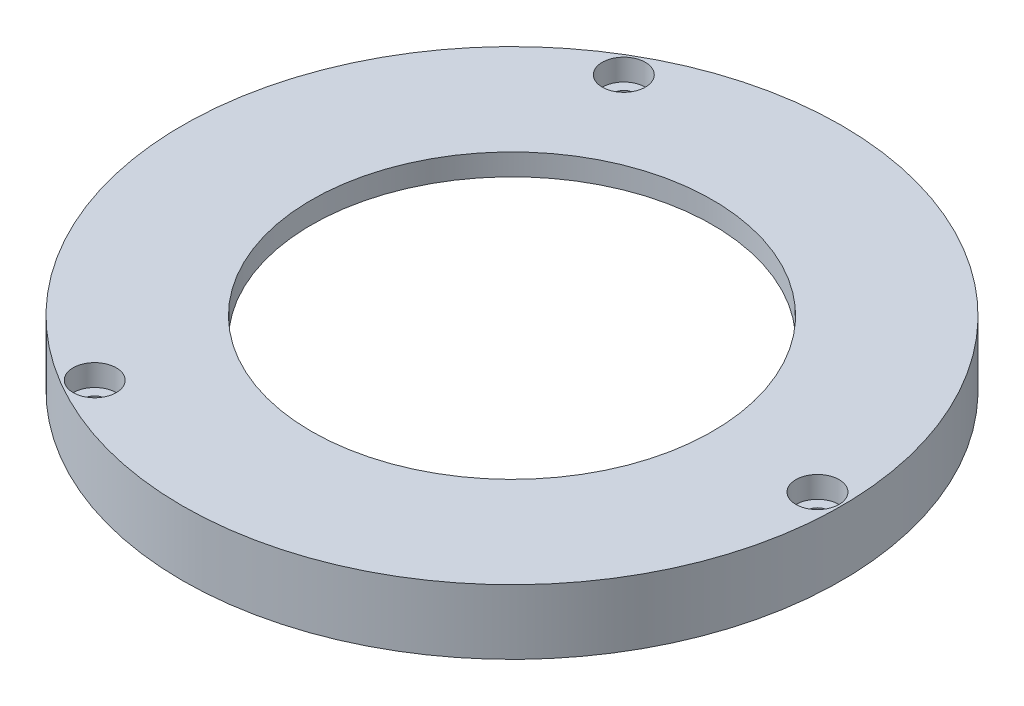
ISO-10303-21;
HEADER;
FILE_DESCRIPTION(('STEP AP214'),'2;1');
FILE_NAME('part.step','',(''),(''),'','','');
FILE_SCHEMA(('AUTOMOTIVE_DESIGN { 1 0 10303 214 1 1 1 1 }'));
ENDSEC;
DATA;
#1=APPLICATION_CONTEXT('core data for automotive mechanical design processes');
#2=APPLICATION_PROTOCOL_DEFINITION('international standard','automotive_design',2000,#1);
#3=PRODUCT_CONTEXT('',#1,'mechanical');
#4=PRODUCT('Part','Part','',(#3));
#5=PRODUCT_RELATED_PRODUCT_CATEGORY('part','',(#4));
#6=PRODUCT_DEFINITION_FORMATION('','',#4);
#7=PRODUCT_DEFINITION_CONTEXT('part definition',#1,'design');
#8=PRODUCT_DEFINITION('design','',#6,#7);
#9=PRODUCT_DEFINITION_SHAPE('','',#8);
#10=(LENGTH_UNIT() NAMED_UNIT(*) SI_UNIT(.MILLI.,.METRE.));
#11=(NAMED_UNIT(*) PLANE_ANGLE_UNIT() SI_UNIT($,.RADIAN.));
#12=(NAMED_UNIT(*) SI_UNIT($,.STERADIAN.) SOLID_ANGLE_UNIT());
#13=UNCERTAINTY_MEASURE_WITH_UNIT(LENGTH_MEASURE(1.E-05),#10,'distance_accuracy_value','');
#14=(GEOMETRIC_REPRESENTATION_CONTEXT(3) GLOBAL_UNCERTAINTY_ASSIGNED_CONTEXT((#13)) GLOBAL_UNIT_ASSIGNED_CONTEXT((#10,
#11,#12)) REPRESENTATION_CONTEXT('',''));
#15=CARTESIAN_POINT('',(0.,0.,0.));
#16=DIRECTION('',(0.,0.,1.));
#17=DIRECTION('',(1.,0.,0.));
#18=AXIS2_PLACEMENT_3D('',#15,#16,#17);
#19=CARTESIAN_POINT('',(-21.25,-6.,36.8060796608387));
#20=DIRECTION('',(0.,1.,0.));
#21=DIRECTION('',(0.,0.,1.));
#22=AXIS2_PLACEMENT_3D('',#19,#20,#21);
#23=CYLINDRICAL_SURFACE('',#22,1.5635);
#24=CARTESIAN_POINT('',(-21.25,-6.,36.8060796608387));
#25=DIRECTION('',(0.,1.,0.));
#26=DIRECTION('',(0.,0.,1.));
#27=AXIS2_PLACEMENT_3D('',#24,#25,#26);
#28=CIRCLE('',#27,1.5635);
#29=CARTESIAN_POINT('',(-21.25,-6.,38.3695796608387));
#30=VERTEX_POINT('',#29);
#31=EDGE_CURVE('E45',#30,#30,#28,.T.);
#32=ORIENTED_EDGE('',*,*,#31,.F.);
#33=EDGE_LOOP('',(#32));
#34=FACE_BOUND('',#33,.T.);
#35=CARTESIAN_POINT('',(-21.25,0.,36.8060796608387));
#36=DIRECTION('',(0.,1.,0.));
#37=DIRECTION('',(0.,0.,1.));
#38=AXIS2_PLACEMENT_3D('',#35,#36,#37);
#39=CIRCLE('',#38,1.5635);
#40=CARTESIAN_POINT('',(-21.25,0.,38.3695796608387));
#41=VERTEX_POINT('',#40);
#42=EDGE_CURVE('E41',#41,#41,#39,.F.);
#43=ORIENTED_EDGE('',*,*,#42,.F.);
#44=EDGE_LOOP('',(#43));
#45=FACE_BOUND('',#44,.T.);
#46=ADVANCED_FACE('F37',(#34,#45),#23,.F.);
#47=CARTESIAN_POINT('',(-21.25,-6.,-36.8060796608386));
#48=DIRECTION('',(0.,1.,0.));
#49=DIRECTION('',(0.,0.,1.));
#50=AXIS2_PLACEMENT_3D('',#47,#48,#49);
#51=CYLINDRICAL_SURFACE('',#50,1.5635);
#52=CARTESIAN_POINT('',(-21.25,-6.,-36.8060796608386));
#53=DIRECTION('',(0.,1.,0.));
#54=DIRECTION('',(0.,0.,1.));
#55=AXIS2_PLACEMENT_3D('',#52,#53,#54);
#56=CIRCLE('',#55,1.5635);
#57=CARTESIAN_POINT('',(-21.25,-6.,-35.2425796608387));
#58=VERTEX_POINT('',#57);
#59=EDGE_CURVE('E50',#58,#58,#56,.T.);
#60=ORIENTED_EDGE('',*,*,#59,.F.);
#61=EDGE_LOOP('',(#60));
#62=FACE_BOUND('',#61,.T.);
#63=CARTESIAN_POINT('',(-21.25,0.,-36.8060796608386));
#64=DIRECTION('',(0.,1.,0.));
#65=DIRECTION('',(0.,0.,1.));
#66=AXIS2_PLACEMENT_3D('',#63,#64,#65);
#67=CIRCLE('',#66,1.5635);
#68=CARTESIAN_POINT('',(-21.25,0.,-35.2425796608387));
#69=VERTEX_POINT('',#68);
#70=EDGE_CURVE('E61',#69,#69,#67,.F.);
#71=ORIENTED_EDGE('',*,*,#70,.F.);
#72=EDGE_LOOP('',(#71));
#73=FACE_BOUND('',#72,.T.);
#74=ADVANCED_FACE('F89',(#62,#73),#51,.F.);
#75=CARTESIAN_POINT('',(42.5,-6.,0.));
#76=DIRECTION('',(0.,1.,0.));
#77=DIRECTION('',(0.,0.,1.));
#78=AXIS2_PLACEMENT_3D('',#75,#76,#77);
#79=CYLINDRICAL_SURFACE('',#78,1.5635);
#80=CARTESIAN_POINT('',(42.5,-6.,0.));
#81=DIRECTION('',(0.,1.,0.));
#82=DIRECTION('',(0.,0.,1.));
#83=AXIS2_PLACEMENT_3D('',#80,#81,#82);
#84=CIRCLE('',#83,1.5635);
#85=CARTESIAN_POINT('',(42.5,-6.,1.5635));
#86=VERTEX_POINT('',#85);
#87=EDGE_CURVE('E57',#86,#86,#84,.T.);
#88=ORIENTED_EDGE('',*,*,#87,.F.);
#89=EDGE_LOOP('',(#88));
#90=FACE_BOUND('',#89,.T.);
#91=CARTESIAN_POINT('',(42.5,0.,0.));
#92=DIRECTION('',(0.,1.,0.));
#93=DIRECTION('',(0.,0.,1.));
#94=AXIS2_PLACEMENT_3D('',#91,#92,#93);
#95=CIRCLE('',#94,1.5635);
#96=CARTESIAN_POINT('',(42.5,0.,1.5635));
#97=VERTEX_POINT('',#96);
#98=EDGE_CURVE('E59',#97,#97,#95,.F.);
#99=ORIENTED_EDGE('',*,*,#98,.F.);
#100=EDGE_LOOP('',(#99));
#101=FACE_BOUND('',#100,.T.);
#102=ADVANCED_FACE('F39',(#90,#101),#79,.F.);
#103=CARTESIAN_POINT('',(0.,-6.,0.));
#104=DIRECTION('',(0.,1.,0.));
#105=DIRECTION('',(0.,0.,1.));
#106=AXIS2_PLACEMENT_3D('',#103,#104,#105);
#107=CYLINDRICAL_SURFACE('',#106,39.3);
#108=CARTESIAN_POINT('',(0.,-6.,0.));
#109=DIRECTION('',(0.,1.,0.));
#110=DIRECTION('',(0.,0.,1.));
#111=AXIS2_PLACEMENT_3D('',#108,#109,#110);
#112=CIRCLE('',#111,39.3);
#113=CARTESIAN_POINT('',(0.,-6.,39.3));
#114=VERTEX_POINT('',#113);
#115=EDGE_CURVE('E81',#114,#114,#112,.T.);
#116=ORIENTED_EDGE('',*,*,#115,.F.);
#117=EDGE_LOOP('',(#116));
#118=FACE_BOUND('',#117,.T.);
#119=CARTESIAN_POINT('',(0.,0.,0.));
#120=DIRECTION('',(0.,1.,0.));
#121=DIRECTION('',(0.,0.,1.));
#122=AXIS2_PLACEMENT_3D('',#119,#120,#121);
#123=CIRCLE('',#122,39.3);
#124=CARTESIAN_POINT('',(0.,0.,39.3));
#125=VERTEX_POINT('',#124);
#126=EDGE_CURVE('E54',#125,#125,#123,.T.);
#127=ORIENTED_EDGE('',*,*,#126,.T.);
#128=EDGE_LOOP('',(#127));
#129=FACE_BOUND('',#128,.T.);
#130=ADVANCED_FACE('F97',(#118,#129),#107,.F.);
#131=CARTESIAN_POINT('',(0.,-6.,0.));
#132=DIRECTION('',(0.,1.,0.));
#133=DIRECTION('',(0.,0.,1.));
#134=AXIS2_PLACEMENT_3D('',#131,#132,#133);
#135=CYLINDRICAL_SURFACE('',#134,45.85);
#136=CARTESIAN_POINT('',(0.,-6.,0.));
#137=DIRECTION('',(0.,1.,0.));
#138=DIRECTION('',(0.,0.,1.));
#139=AXIS2_PLACEMENT_3D('',#136,#137,#138);
#140=CIRCLE('',#139,45.85);
#141=CARTESIAN_POINT('',(0.,-6.,45.85));
#142=VERTEX_POINT('',#141);
#143=EDGE_CURVE('E10',#142,#142,#140,.T.);
#144=ORIENTED_EDGE('',*,*,#143,.T.);
#145=EDGE_LOOP('',(#144));
#146=FACE_BOUND('',#145,.T.);
#147=CARTESIAN_POINT('',(0.,3.,0.));
#148=DIRECTION('',(0.,1.,0.));
#149=DIRECTION('',(0.,0.,1.));
#150=AXIS2_PLACEMENT_3D('',#147,#148,#149);
#151=CIRCLE('',#150,45.85);
#152=CARTESIAN_POINT('',(0.,3.,45.85));
#153=VERTEX_POINT('',#152);
#154=EDGE_CURVE('E58',#153,#153,#151,.T.);
#155=ORIENTED_EDGE('',*,*,#154,.F.);
#156=EDGE_LOOP('',(#155));
#157=FACE_BOUND('',#156,.T.);
#158=ADVANCED_FACE('F103',(#146,#157),#135,.T.);
#159=CARTESIAN_POINT('',(0.,-6.,0.));
#160=DIRECTION('',(0.,1.,0.));
#161=DIRECTION('',(0.,0.,1.));
#162=AXIS2_PLACEMENT_3D('',#159,#160,#161);
#163=PLANE('',#162);
#164=ORIENTED_EDGE('',*,*,#87,.T.);
#165=EDGE_LOOP('',(#164));
#166=FACE_BOUND('',#165,.T.);
#167=ORIENTED_EDGE('',*,*,#115,.T.);
#168=EDGE_LOOP('',(#167));
#169=FACE_BOUND('',#168,.T.);
#170=ORIENTED_EDGE('',*,*,#59,.T.);
#171=EDGE_LOOP('',(#170));
#172=FACE_BOUND('',#171,.T.);
#173=ORIENTED_EDGE('',*,*,#31,.T.);
#174=EDGE_LOOP('',(#173));
#175=FACE_BOUND('',#174,.T.);
#176=ORIENTED_EDGE('',*,*,#143,.F.);
#177=EDGE_LOOP('',(#176));
#178=FACE_BOUND('',#177,.T.);
#179=ADVANCED_FACE('F86',(#166,#169,#172,#175,#178),#163,.F.);
#180=CARTESIAN_POINT('',(0.,0.,0.));
#181=DIRECTION('',(0.,1.,0.));
#182=DIRECTION('',(0.,0.,1.));
#183=AXIS2_PLACEMENT_3D('',#180,#181,#182);
#184=PLANE('',#183);
#185=CARTESIAN_POINT('',(0.,0.,0.));
#186=DIRECTION('',(0.,1.,0.));
#187=DIRECTION('',(0.,0.,1.));
#188=AXIS2_PLACEMENT_3D('',#185,#186,#187);
#189=CIRCLE('',#188,27.9);
#190=CARTESIAN_POINT('',(0.,0.,27.9));
#191=VERTEX_POINT('',#190);
#192=EDGE_CURVE('E67',#191,#191,#189,.T.);
#193=ORIENTED_EDGE('',*,*,#192,.T.);
#194=EDGE_LOOP('',(#193));
#195=FACE_BOUND('',#194,.T.);
#196=ORIENTED_EDGE('',*,*,#126,.F.);
#197=EDGE_LOOP('',(#196));
#198=FACE_BOUND('',#197,.T.);
#199=ADVANCED_FACE('F112',(#195,#198),#184,.F.);
#200=CARTESIAN_POINT('',(0.,3.,0.));
#201=DIRECTION('',(0.,-1.,0.));
#202=DIRECTION('',(0.,0.,-1.));
#203=AXIS2_PLACEMENT_3D('',#200,#201,#202);
#204=CYLINDRICAL_SURFACE('',#203,27.9);
#205=CARTESIAN_POINT('',(0.,3.,0.));
#206=DIRECTION('',(0.,1.,0.));
#207=DIRECTION('',(0.,0.,1.));
#208=AXIS2_PLACEMENT_3D('',#205,#206,#207);
#209=CIRCLE('',#208,27.9);
#210=CARTESIAN_POINT('',(0.,3.,27.9));
#211=VERTEX_POINT('',#210);
#212=EDGE_CURVE('E71',#211,#211,#209,.T.);
#213=ORIENTED_EDGE('',*,*,#212,.T.);
#214=EDGE_LOOP('',(#213));
#215=FACE_BOUND('',#214,.T.);
#216=ORIENTED_EDGE('',*,*,#192,.F.);
#217=EDGE_LOOP('',(#216));
#218=FACE_BOUND('',#217,.T.);
#219=ADVANCED_FACE('F114',(#215,#218),#204,.F.);
#220=CARTESIAN_POINT('',(0.,3.,0.));
#221=DIRECTION('',(0.,1.,0.));
#222=DIRECTION('',(0.,0.,1.));
#223=AXIS2_PLACEMENT_3D('',#220,#221,#222);
#224=PLANE('',#223);
#225=CARTESIAN_POINT('',(42.5,3.,0.));
#226=DIRECTION('',(0.,1.,0.));
#227=DIRECTION('',(0.,0.,1.));
#228=AXIS2_PLACEMENT_3D('',#225,#226,#227);
#229=CIRCLE('',#228,3.);
#230=CARTESIAN_POINT('',(42.5,3.,3.));
#231=VERTEX_POINT('',#230);
#232=EDGE_CURVE('E159',#231,#231,#229,.T.);
#233=ORIENTED_EDGE('',*,*,#232,.F.);
#234=EDGE_LOOP('',(#233));
#235=FACE_BOUND('',#234,.T.);
#236=CARTESIAN_POINT('',(-21.25,3.,36.8060796608387));
#237=DIRECTION('',(0.,1.,0.));
#238=DIRECTION('',(0.,0.,1.));
#239=AXIS2_PLACEMENT_3D('',#236,#237,#238);
#240=CIRCLE('',#239,3.);
#241=CARTESIAN_POINT('',(-21.25,3.,39.8060796608386));
#242=VERTEX_POINT('',#241);
#243=EDGE_CURVE('E162',#242,#242,#240,.T.);
#244=ORIENTED_EDGE('',*,*,#243,.F.);
#245=EDGE_LOOP('',(#244));
#246=FACE_BOUND('',#245,.T.);
#247=CARTESIAN_POINT('',(-21.25,3.,-36.8060796608386));
#248=DIRECTION('',(0.,1.,0.));
#249=DIRECTION('',(0.,0.,1.));
#250=AXIS2_PLACEMENT_3D('',#247,#248,#249);
#251=CIRCLE('',#250,3.);
#252=CARTESIAN_POINT('',(-21.25,3.,-33.8060796608386));
#253=VERTEX_POINT('',#252);
#254=EDGE_CURVE('E170',#253,#253,#251,.T.);
#255=ORIENTED_EDGE('',*,*,#254,.F.);
#256=EDGE_LOOP('',(#255));
#257=FACE_BOUND('',#256,.T.);
#258=ORIENTED_EDGE('',*,*,#212,.F.);
#259=EDGE_LOOP('',(#258));
#260=FACE_BOUND('',#259,.T.);
#261=ORIENTED_EDGE('',*,*,#154,.T.);
#262=EDGE_LOOP('',(#261));
#263=FACE_BOUND('',#262,.T.);
#264=ADVANCED_FACE('F120',(#235,#246,#257,#260,#263),#224,.T.);
#265=CARTESIAN_POINT('',(-21.25,0.,-36.8060796608386));
#266=DIRECTION('',(0.,1.,0.));
#267=DIRECTION('',(0.,0.,1.));
#268=AXIS2_PLACEMENT_3D('',#265,#266,#267);
#269=PLANE('',#268);
#270=CARTESIAN_POINT('',(-21.25,0.,-36.8060796608386));
#271=DIRECTION('',(0.,1.,0.));
#272=DIRECTION('',(0.,0.,1.));
#273=AXIS2_PLACEMENT_3D('',#270,#271,#272);
#274=CIRCLE('',#273,3.);
#275=CARTESIAN_POINT('',(-21.25,0.,-33.8060796608386));
#276=VERTEX_POINT('',#275);
#277=EDGE_CURVE('E173',#276,#276,#274,.T.);
#278=ORIENTED_EDGE('',*,*,#277,.T.);
#279=EDGE_LOOP('',(#278));
#280=FACE_BOUND('',#279,.T.);
#281=ORIENTED_EDGE('',*,*,#70,.T.);
#282=EDGE_LOOP('',(#281));
#283=FACE_BOUND('',#282,.T.);
#284=ADVANCED_FACE('F128',(#280,#283),#269,.T.);
#285=CARTESIAN_POINT('',(-21.25,0.,-36.8060796608386));
#286=DIRECTION('',(0.,1.,0.));
#287=DIRECTION('',(0.,0.,1.));
#288=AXIS2_PLACEMENT_3D('',#285,#286,#287);
#289=CYLINDRICAL_SURFACE('',#288,3.);
#290=ORIENTED_EDGE('',*,*,#277,.F.);
#291=EDGE_LOOP('',(#290));
#292=FACE_BOUND('',#291,.T.);
#293=ORIENTED_EDGE('',*,*,#254,.T.);
#294=EDGE_LOOP('',(#293));
#295=FACE_BOUND('',#294,.T.);
#296=ADVANCED_FACE('F132',(#292,#295),#289,.F.);
#297=CARTESIAN_POINT('',(-21.25,0.,36.8060796608387));
#298=DIRECTION('',(0.,1.,0.));
#299=DIRECTION('',(0.,0.,1.));
#300=AXIS2_PLACEMENT_3D('',#297,#298,#299);
#301=PLANE('',#300);
#302=CARTESIAN_POINT('',(-21.25,0.,36.8060796608387));
#303=DIRECTION('',(0.,1.,0.));
#304=DIRECTION('',(0.,0.,1.));
#305=AXIS2_PLACEMENT_3D('',#302,#303,#304);
#306=CIRCLE('',#305,3.);
#307=CARTESIAN_POINT('',(-21.25,0.,39.8060796608386));
#308=VERTEX_POINT('',#307);
#309=EDGE_CURVE('E167',#308,#308,#306,.T.);
#310=ORIENTED_EDGE('',*,*,#309,.T.);
#311=EDGE_LOOP('',(#310));
#312=FACE_BOUND('',#311,.T.);
#313=ORIENTED_EDGE('',*,*,#42,.T.);
#314=EDGE_LOOP('',(#313));
#315=FACE_BOUND('',#314,.T.);
#316=ADVANCED_FACE('F136',(#312,#315),#301,.T.);
#317=CARTESIAN_POINT('',(-21.25,0.,36.8060796608387));
#318=DIRECTION('',(0.,1.,0.));
#319=DIRECTION('',(0.,0.,1.));
#320=AXIS2_PLACEMENT_3D('',#317,#318,#319);
#321=CYLINDRICAL_SURFACE('',#320,3.);
#322=ORIENTED_EDGE('',*,*,#309,.F.);
#323=EDGE_LOOP('',(#322));
#324=FACE_BOUND('',#323,.T.);
#325=ORIENTED_EDGE('',*,*,#243,.T.);
#326=EDGE_LOOP('',(#325));
#327=FACE_BOUND('',#326,.T.);
#328=ADVANCED_FACE('F140',(#324,#327),#321,.F.);
#329=CARTESIAN_POINT('',(42.5,0.,0.));
#330=DIRECTION('',(0.,1.,0.));
#331=DIRECTION('',(0.,0.,1.));
#332=AXIS2_PLACEMENT_3D('',#329,#330,#331);
#333=PLANE('',#332);
#334=CARTESIAN_POINT('',(42.5,0.,0.));
#335=DIRECTION('',(0.,1.,0.));
#336=DIRECTION('',(0.,0.,1.));
#337=AXIS2_PLACEMENT_3D('',#334,#335,#336);
#338=CIRCLE('',#337,3.);
#339=CARTESIAN_POINT('',(42.5,0.,3.));
#340=VERTEX_POINT('',#339);
#341=EDGE_CURVE('E62',#340,#340,#338,.T.);
#342=ORIENTED_EDGE('',*,*,#341,.T.);
#343=EDGE_LOOP('',(#342));
#344=FACE_BOUND('',#343,.T.);
#345=ORIENTED_EDGE('',*,*,#98,.T.);
#346=EDGE_LOOP('',(#345));
#347=FACE_BOUND('',#346,.T.);
#348=ADVANCED_FACE('F144',(#344,#347),#333,.T.);
#349=CARTESIAN_POINT('',(42.5,0.,0.));
#350=DIRECTION('',(0.,1.,0.));
#351=DIRECTION('',(0.,0.,1.));
#352=AXIS2_PLACEMENT_3D('',#349,#350,#351);
#353=CYLINDRICAL_SURFACE('',#352,3.);
#354=ORIENTED_EDGE('',*,*,#341,.F.);
#355=EDGE_LOOP('',(#354));
#356=FACE_BOUND('',#355,.T.);
#357=ORIENTED_EDGE('',*,*,#232,.T.);
#358=EDGE_LOOP('',(#357));
#359=FACE_BOUND('',#358,.T.);
#360=ADVANCED_FACE('F146',(#356,#359),#353,.F.);
#361=CLOSED_SHELL('',(#46,#74,#102,#130,#158,#179,#199,#219,#264,#284,#296,#316,#328,#348,#360));
#362=MANIFOLD_SOLID_BREP('B2',#361);
#363=ADVANCED_BREP_SHAPE_REPRESENTATION('',(#18,#362),#14);
#364=SHAPE_DEFINITION_REPRESENTATION(#9,#363);
ENDSEC;
END-ISO-10303-21;
